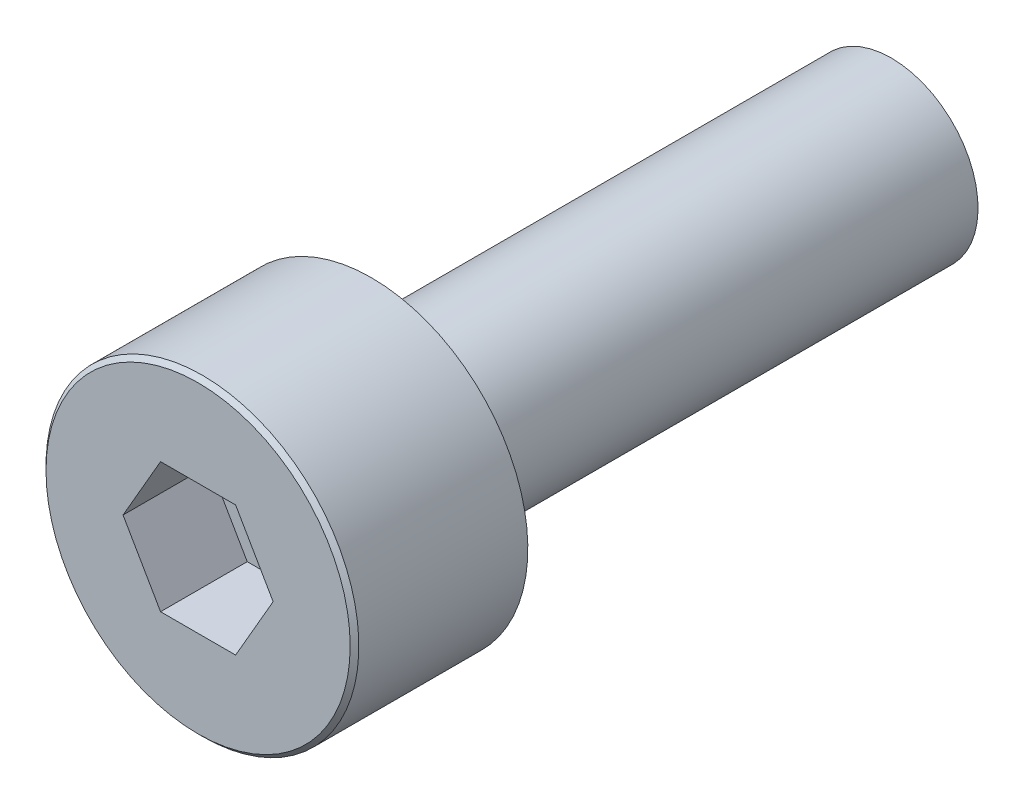
ISO-10303-21;
HEADER;
FILE_DESCRIPTION(('STEP AP214'),'2;1');
FILE_NAME('part.step','',(''),(''),'','','');
FILE_SCHEMA(('AUTOMOTIVE_DESIGN { 1 0 10303 214 1 1 1 1 }'));
ENDSEC;
DATA;
#1=APPLICATION_CONTEXT('core data for automotive mechanical design processes');
#2=APPLICATION_PROTOCOL_DEFINITION('international standard','automotive_design',2000,#1);
#3=PRODUCT_CONTEXT('',#1,'mechanical');
#4=PRODUCT('Part','Part','',(#3));
#5=PRODUCT_RELATED_PRODUCT_CATEGORY('part','',(#4));
#6=PRODUCT_DEFINITION_FORMATION('','',#4);
#7=PRODUCT_DEFINITION_CONTEXT('part definition',#1,'design');
#8=PRODUCT_DEFINITION('design','',#6,#7);
#9=PRODUCT_DEFINITION_SHAPE('','',#8);
#10=(LENGTH_UNIT() NAMED_UNIT(*) SI_UNIT(.MILLI.,.METRE.));
#11=(NAMED_UNIT(*) PLANE_ANGLE_UNIT() SI_UNIT($,.RADIAN.));
#12=(NAMED_UNIT(*) SI_UNIT($,.STERADIAN.) SOLID_ANGLE_UNIT());
#13=UNCERTAINTY_MEASURE_WITH_UNIT(LENGTH_MEASURE(1.E-05),#10,'distance_accuracy_value','');
#14=(GEOMETRIC_REPRESENTATION_CONTEXT(3) GLOBAL_UNCERTAINTY_ASSIGNED_CONTEXT((#13)) GLOBAL_UNIT_ASSIGNED_CONTEXT((#10,
#11,#12)) REPRESENTATION_CONTEXT('',''));
#15=CARTESIAN_POINT('',(0.,0.,0.));
#16=DIRECTION('',(0.,0.,1.));
#17=DIRECTION('',(1.,0.,0.));
#18=AXIS2_PLACEMENT_3D('',#15,#16,#17);
#19=CARTESIAN_POINT('',(0.,0.,0.));
#20=DIRECTION('',(0.,0.,1.));
#21=DIRECTION('',(0.,-1.,0.));
#22=AXIS2_PLACEMENT_3D('',#19,#20,#21);
#23=PLANE('',#22);
#24=CARTESIAN_POINT('',(0.,0.,0.));
#25=DIRECTION('',(0.,0.,1.));
#26=DIRECTION('',(0.,-1.,0.));
#27=AXIS2_PLACEMENT_3D('',#24,#25,#26);
#28=CIRCLE('',#27,3.51);
#29=CARTESIAN_POINT('',(0.,-3.51,0.));
#30=VERTEX_POINT('',#29);
#31=EDGE_CURVE('E11',#30,#30,#28,.T.);
#32=ORIENTED_EDGE('',*,*,#31,.T.);
#33=EDGE_LOOP('',(#32));
#34=FACE_BOUND('',#33,.T.);
#35=DIRECTION('',(-0.5,0.866025403784438,0.));
#36=VECTOR('',#35,1.);
#37=CARTESIAN_POINT('',(1.73205080756888,0.,0.));
#38=LINE('',#37,#36);
#39=CARTESIAN_POINT('',(1.73205080756888,0.,0.));
#40=VERTEX_POINT('',#39);
#41=CARTESIAN_POINT('',(0.866025403784438,1.5,0.));
#42=VERTEX_POINT('',#41);
#43=EDGE_CURVE('E61',#40,#42,#38,.T.);
#44=ORIENTED_EDGE('',*,*,#43,.F.);
#45=DIRECTION('',(0.5,0.866025403784438,0.));
#46=VECTOR('',#45,1.);
#47=CARTESIAN_POINT('',(0.866025403784438,-1.5,0.));
#48=LINE('',#47,#46);
#49=CARTESIAN_POINT('',(0.866025403784438,-1.5,0.));
#50=VERTEX_POINT('',#49);
#51=EDGE_CURVE('E144',#50,#40,#48,.T.);
#52=ORIENTED_EDGE('',*,*,#51,.F.);
#53=DIRECTION('',(1.,0.,0.));
#54=VECTOR('',#53,1.);
#55=CARTESIAN_POINT('',(-0.866025403784438,-1.5,0.));
#56=LINE('',#55,#54);
#57=CARTESIAN_POINT('',(-0.866025403784438,-1.5,0.));
#58=VERTEX_POINT('',#57);
#59=EDGE_CURVE('E142',#58,#50,#56,.T.);
#60=ORIENTED_EDGE('',*,*,#59,.F.);
#61=DIRECTION('',(0.5,-0.866025403784439,0.));
#62=VECTOR('',#61,1.);
#63=CARTESIAN_POINT('',(-1.73205080756888,0.,0.));
#64=LINE('',#63,#62);
#65=CARTESIAN_POINT('',(-1.73205080756888,0.,0.));
#66=VERTEX_POINT('',#65);
#67=EDGE_CURVE('E109',#66,#58,#64,.T.);
#68=ORIENTED_EDGE('',*,*,#67,.F.);
#69=DIRECTION('',(-0.5,-0.866025403784439,0.));
#70=VECTOR('',#69,1.);
#71=CARTESIAN_POINT('',(-0.866025403784439,1.5,0.));
#72=LINE('',#71,#70);
#73=CARTESIAN_POINT('',(-0.866025403784439,1.5,0.));
#74=VERTEX_POINT('',#73);
#75=EDGE_CURVE('E138',#74,#66,#72,.T.);
#76=ORIENTED_EDGE('',*,*,#75,.F.);
#77=DIRECTION('',(-1.,0.,0.));
#78=VECTOR('',#77,1.);
#79=CARTESIAN_POINT('',(0.866025403784438,1.5,0.));
#80=LINE('',#79,#78);
#81=EDGE_CURVE('E135',#42,#74,#80,.T.);
#82=ORIENTED_EDGE('',*,*,#81,.F.);
#83=EDGE_LOOP('',(#44,#52,#60,#68,#76,#82));
#84=FACE_BOUND('',#83,.T.);
#85=ADVANCED_FACE('F45',(#34,#84),#23,.T.);
#86=CARTESIAN_POINT('',(0.,0.,-16.));
#87=DIRECTION('',(0.,0.,-1.));
#88=DIRECTION('',(0.,1.,0.));
#89=AXIS2_PLACEMENT_3D('',#86,#87,#88);
#90=CYLINDRICAL_SURFACE('',#89,3.61);
#91=CARTESIAN_POINT('',(0.,0.,-0.100000000000003));
#92=DIRECTION('',(0.,0.,1.));
#93=DIRECTION('',(0.,-1.,0.));
#94=AXIS2_PLACEMENT_3D('',#91,#92,#93);
#95=CIRCLE('',#94,3.61);
#96=CARTESIAN_POINT('',(0.,-3.61,-0.100000000000003));
#97=VERTEX_POINT('',#96);
#98=EDGE_CURVE('E54',#97,#97,#95,.F.);
#99=ORIENTED_EDGE('',*,*,#98,.T.);
#100=EDGE_LOOP('',(#99));
#101=FACE_BOUND('',#100,.T.);
#102=CARTESIAN_POINT('',(0.,0.,-4.));
#103=DIRECTION('',(0.,0.,-1.));
#104=DIRECTION('',(0.,1.,0.));
#105=AXIS2_PLACEMENT_3D('',#102,#103,#104);
#106=CIRCLE('',#105,3.61);
#107=CARTESIAN_POINT('',(0.,3.61,-4.));
#108=VERTEX_POINT('',#107);
#109=EDGE_CURVE('E159',#108,#108,#106,.T.);
#110=ORIENTED_EDGE('',*,*,#109,.F.);
#111=EDGE_LOOP('',(#110));
#112=FACE_BOUND('',#111,.T.);
#113=ADVANCED_FACE('F164',(#101,#112),#90,.T.);
#114=CARTESIAN_POINT('',(0.,3.61,-4.));
#115=DIRECTION('',(0.,0.,-1.));
#116=DIRECTION('',(0.,1.,0.));
#117=AXIS2_PLACEMENT_3D('',#114,#115,#116);
#118=PLANE('',#117);
#119=ORIENTED_EDGE('',*,*,#109,.T.);
#120=EDGE_LOOP('',(#119));
#121=FACE_BOUND('',#120,.T.);
#122=CARTESIAN_POINT('',(0.,0.,-4.));
#123=DIRECTION('',(0.,0.,-1.));
#124=DIRECTION('',(0.,1.,0.));
#125=AXIS2_PLACEMENT_3D('',#122,#123,#124);
#126=CIRCLE('',#125,2.);
#127=CARTESIAN_POINT('',(0.,2.,-4.));
#128=VERTEX_POINT('',#127);
#129=EDGE_CURVE('E156',#128,#128,#126,.T.);
#130=ORIENTED_EDGE('',*,*,#129,.F.);
#131=EDGE_LOOP('',(#130));
#132=FACE_BOUND('',#131,.T.);
#133=ADVANCED_FACE('F180',(#121,#132),#118,.T.);
#134=CARTESIAN_POINT('',(0.,0.,-16.));
#135=DIRECTION('',(0.,0.,-1.));
#136=DIRECTION('',(0.,1.,0.));
#137=AXIS2_PLACEMENT_3D('',#134,#135,#136);
#138=CYLINDRICAL_SURFACE('',#137,2.);
#139=ORIENTED_EDGE('',*,*,#129,.T.);
#140=EDGE_LOOP('',(#139));
#141=FACE_BOUND('',#140,.T.);
#142=CARTESIAN_POINT('',(0.,0.,-16.));
#143=DIRECTION('',(0.,0.,-1.));
#144=DIRECTION('',(0.,1.,0.));
#145=AXIS2_PLACEMENT_3D('',#142,#143,#144);
#146=CIRCLE('',#145,2.);
#147=CARTESIAN_POINT('',(0.,2.,-16.));
#148=VERTEX_POINT('',#147);
#149=EDGE_CURVE('E148',#148,#148,#146,.T.);
#150=ORIENTED_EDGE('',*,*,#149,.F.);
#151=EDGE_LOOP('',(#150));
#152=FACE_BOUND('',#151,.T.);
#153=ADVANCED_FACE('F186',(#141,#152),#138,.T.);
#154=CARTESIAN_POINT('',(0.,2.,-16.));
#155=DIRECTION('',(0.,0.,-1.));
#156=DIRECTION('',(0.,1.,0.));
#157=AXIS2_PLACEMENT_3D('',#154,#155,#156);
#158=PLANE('',#157);
#159=ORIENTED_EDGE('',*,*,#149,.T.);
#160=EDGE_LOOP('',(#159));
#161=FACE_BOUND('',#160,.T.);
#162=ADVANCED_FACE('F190',(#161),#158,.T.);
#163=CARTESIAN_POINT('',(1.73205080756888,0.,-2.));
#164=DIRECTION('',(0.866025403784438,0.5,0.));
#165=DIRECTION('',(-0.5,0.866025403784439,0.));
#166=AXIS2_PLACEMENT_3D('',#163,#164,#165);
#167=PLANE('',#166);
#168=ORIENTED_EDGE('',*,*,#43,.T.);
#169=DIRECTION('',(0.,0.,1.));
#170=VECTOR('',#169,1.);
#171=CARTESIAN_POINT('',(0.866025403784438,1.5,-2.));
#172=LINE('',#171,#170);
#173=CARTESIAN_POINT('',(0.866025403784438,1.5,-2.));
#174=VERTEX_POINT('',#173);
#175=EDGE_CURVE('E91',#174,#42,#172,.T.);
#176=ORIENTED_EDGE('',*,*,#175,.F.);
#177=DIRECTION('',(-0.5,0.866025403784438,0.));
#178=VECTOR('',#177,1.);
#179=CARTESIAN_POINT('',(1.73205080756888,0.,-2.));
#180=LINE('',#179,#178);
#181=CARTESIAN_POINT('',(1.73205080756888,0.,-2.));
#182=VERTEX_POINT('',#181);
#183=EDGE_CURVE('E146',#182,#174,#180,.T.);
#184=ORIENTED_EDGE('',*,*,#183,.F.);
#185=DIRECTION('',(0.,0.,1.));
#186=VECTOR('',#185,1.);
#187=CARTESIAN_POINT('',(1.73205080756888,0.,-2.));
#188=LINE('',#187,#186);
#189=EDGE_CURVE('E69',#182,#40,#188,.T.);
#190=ORIENTED_EDGE('',*,*,#189,.T.);
#191=EDGE_LOOP('',(#168,#176,#184,#190));
#192=FACE_BOUND('',#191,.T.);
#193=ADVANCED_FACE('F194',(#192),#167,.F.);
#194=CARTESIAN_POINT('',(0.866025403784438,-1.5,-2.));
#195=DIRECTION('',(0.866025403784439,-0.5,0.));
#196=DIRECTION('',(0.5,0.866025403784438,0.));
#197=AXIS2_PLACEMENT_3D('',#194,#195,#196);
#198=PLANE('',#197);
#199=ORIENTED_EDGE('',*,*,#51,.T.);
#200=ORIENTED_EDGE('',*,*,#189,.F.);
#201=DIRECTION('',(0.5,0.866025403784438,0.));
#202=VECTOR('',#201,1.);
#203=CARTESIAN_POINT('',(0.866025403784438,-1.5,-2.));
#204=LINE('',#203,#202);
#205=CARTESIAN_POINT('',(0.866025403784438,-1.5,-2.));
#206=VERTEX_POINT('',#205);
#207=EDGE_CURVE('E121',#206,#182,#204,.T.);
#208=ORIENTED_EDGE('',*,*,#207,.F.);
#209=DIRECTION('',(0.,0.,1.));
#210=VECTOR('',#209,1.);
#211=CARTESIAN_POINT('',(0.866025403784438,-1.5,-2.));
#212=LINE('',#211,#210);
#213=EDGE_CURVE('E113',#206,#50,#212,.T.);
#214=ORIENTED_EDGE('',*,*,#213,.T.);
#215=EDGE_LOOP('',(#199,#200,#208,#214));
#216=FACE_BOUND('',#215,.T.);
#217=ADVANCED_FACE('F198',(#216),#198,.F.);
#218=CARTESIAN_POINT('',(-0.866025403784438,-1.5,-2.));
#219=DIRECTION('',(0.,-1.,0.));
#220=DIRECTION('',(0.,0.,-1.));
#221=AXIS2_PLACEMENT_3D('',#218,#219,#220);
#222=PLANE('',#221);
#223=ORIENTED_EDGE('',*,*,#59,.T.);
#224=ORIENTED_EDGE('',*,*,#213,.F.);
#225=DIRECTION('',(1.,0.,0.));
#226=VECTOR('',#225,1.);
#227=CARTESIAN_POINT('',(-0.866025403784438,-1.5,-2.));
#228=LINE('',#227,#226);
#229=CARTESIAN_POINT('',(-0.866025403784438,-1.5,-2.));
#230=VERTEX_POINT('',#229);
#231=EDGE_CURVE('E117',#230,#206,#228,.T.);
#232=ORIENTED_EDGE('',*,*,#231,.F.);
#233=DIRECTION('',(0.,0.,1.));
#234=VECTOR('',#233,1.);
#235=CARTESIAN_POINT('',(-0.866025403784438,-1.5,-2.));
#236=LINE('',#235,#234);
#237=EDGE_CURVE('E102',#230,#58,#236,.T.);
#238=ORIENTED_EDGE('',*,*,#237,.T.);
#239=EDGE_LOOP('',(#223,#224,#232,#238));
#240=FACE_BOUND('',#239,.T.);
#241=ADVANCED_FACE('F118',(#240),#222,.F.);
#242=CARTESIAN_POINT('',(-1.73205080756888,0.,-2.));
#243=DIRECTION('',(-0.866025403784439,-0.5,0.));
#244=DIRECTION('',(0.5,-0.866025403784439,0.));
#245=AXIS2_PLACEMENT_3D('',#242,#243,#244);
#246=PLANE('',#245);
#247=ORIENTED_EDGE('',*,*,#67,.T.);
#248=ORIENTED_EDGE('',*,*,#237,.F.);
#249=DIRECTION('',(0.5,-0.866025403784439,0.));
#250=VECTOR('',#249,1.);
#251=CARTESIAN_POINT('',(-1.73205080756888,0.,-2.));
#252=LINE('',#251,#250);
#253=CARTESIAN_POINT('',(-1.73205080756888,0.,-2.));
#254=VERTEX_POINT('',#253);
#255=EDGE_CURVE('E106',#254,#230,#252,.T.);
#256=ORIENTED_EDGE('',*,*,#255,.F.);
#257=DIRECTION('',(0.,0.,1.));
#258=VECTOR('',#257,1.);
#259=CARTESIAN_POINT('',(-1.73205080756888,0.,-2.));
#260=LINE('',#259,#258);
#261=EDGE_CURVE('E114',#254,#66,#260,.T.);
#262=ORIENTED_EDGE('',*,*,#261,.T.);
#263=EDGE_LOOP('',(#247,#248,#256,#262));
#264=FACE_BOUND('',#263,.T.);
#265=ADVANCED_FACE('F104',(#264),#246,.F.);
#266=CARTESIAN_POINT('',(-0.866025403784439,1.5,-2.));
#267=DIRECTION('',(-0.866025403784439,0.5,0.));
#268=DIRECTION('',(-0.5,-0.866025403784439,0.));
#269=AXIS2_PLACEMENT_3D('',#266,#267,#268);
#270=PLANE('',#269);
#271=ORIENTED_EDGE('',*,*,#75,.T.);
#272=ORIENTED_EDGE('',*,*,#261,.F.);
#273=DIRECTION('',(-0.5,-0.866025403784439,0.));
#274=VECTOR('',#273,1.);
#275=CARTESIAN_POINT('',(-0.866025403784439,1.5,-2.));
#276=LINE('',#275,#274);
#277=CARTESIAN_POINT('',(-0.866025403784439,1.5,-2.));
#278=VERTEX_POINT('',#277);
#279=EDGE_CURVE('E127',#278,#254,#276,.T.);
#280=ORIENTED_EDGE('',*,*,#279,.F.);
#281=DIRECTION('',(0.,0.,1.));
#282=VECTOR('',#281,1.);
#283=CARTESIAN_POINT('',(-0.866025403784439,1.5,-2.));
#284=LINE('',#283,#282);
#285=EDGE_CURVE('E151',#278,#74,#284,.T.);
#286=ORIENTED_EDGE('',*,*,#285,.T.);
#287=EDGE_LOOP('',(#271,#272,#280,#286));
#288=FACE_BOUND('',#287,.T.);
#289=ADVANCED_FACE('F201',(#288),#270,.F.);
#290=CARTESIAN_POINT('',(0.866025403784438,1.5,-2.));
#291=DIRECTION('',(0.,1.,0.));
#292=DIRECTION('',(-1.,0.,0.));
#293=AXIS2_PLACEMENT_3D('',#290,#291,#292);
#294=PLANE('',#293);
#295=ORIENTED_EDGE('',*,*,#81,.T.);
#296=ORIENTED_EDGE('',*,*,#285,.F.);
#297=DIRECTION('',(-1.,0.,0.));
#298=VECTOR('',#297,1.);
#299=CARTESIAN_POINT('',(0.866025403784438,1.5,-2.));
#300=LINE('',#299,#298);
#301=EDGE_CURVE('E129',#174,#278,#300,.T.);
#302=ORIENTED_EDGE('',*,*,#301,.F.);
#303=ORIENTED_EDGE('',*,*,#175,.T.);
#304=EDGE_LOOP('',(#295,#296,#302,#303));
#305=FACE_BOUND('',#304,.T.);
#306=ADVANCED_FACE('F172',(#305),#294,.F.);
#307=CARTESIAN_POINT('',(0.,0.,-2.));
#308=DIRECTION('',(0.,0.,1.));
#309=DIRECTION('',(1.,0.,0.));
#310=AXIS2_PLACEMENT_3D('',#307,#308,#309);
#311=PLANE('',#310);
#312=ORIENTED_EDGE('',*,*,#183,.T.);
#313=ORIENTED_EDGE('',*,*,#301,.T.);
#314=ORIENTED_EDGE('',*,*,#279,.T.);
#315=ORIENTED_EDGE('',*,*,#255,.T.);
#316=ORIENTED_EDGE('',*,*,#231,.T.);
#317=ORIENTED_EDGE('',*,*,#207,.T.);
#318=EDGE_LOOP('',(#312,#313,#314,#315,#316,#317));
#319=FACE_BOUND('',#318,.T.);
#320=ADVANCED_FACE('F124',(#319),#311,.T.);
#321=CARTESIAN_POINT('',(0.,0.,-0.100000000000003));
#322=DIRECTION('',(0.,0.,-1.));
#323=DIRECTION('',(0.,1.,0.));
#324=AXIS2_PLACEMENT_3D('',#321,#322,#323);
#325=CONICAL_SURFACE('',#324,3.61,0.785398163397438);
#326=ORIENTED_EDGE('',*,*,#31,.F.);
#327=EDGE_LOOP('',(#326));
#328=FACE_BOUND('',#327,.T.);
#329=ORIENTED_EDGE('',*,*,#98,.F.);
#330=EDGE_LOOP('',(#329));
#331=FACE_BOUND('',#330,.T.);
#332=ADVANCED_FACE('F48',(#328,#331),#325,.T.);
#333=CLOSED_SHELL('',(#85,#113,#133,#153,#162,#193,#217,#241,#265,#289,#306,#320,#332));
#334=MANIFOLD_SOLID_BREP('B2',#333);
#335=ADVANCED_BREP_SHAPE_REPRESENTATION('',(#18,#334),#14);
#336=SHAPE_DEFINITION_REPRESENTATION(#9,#335);
ENDSEC;
END-ISO-10303-21;
